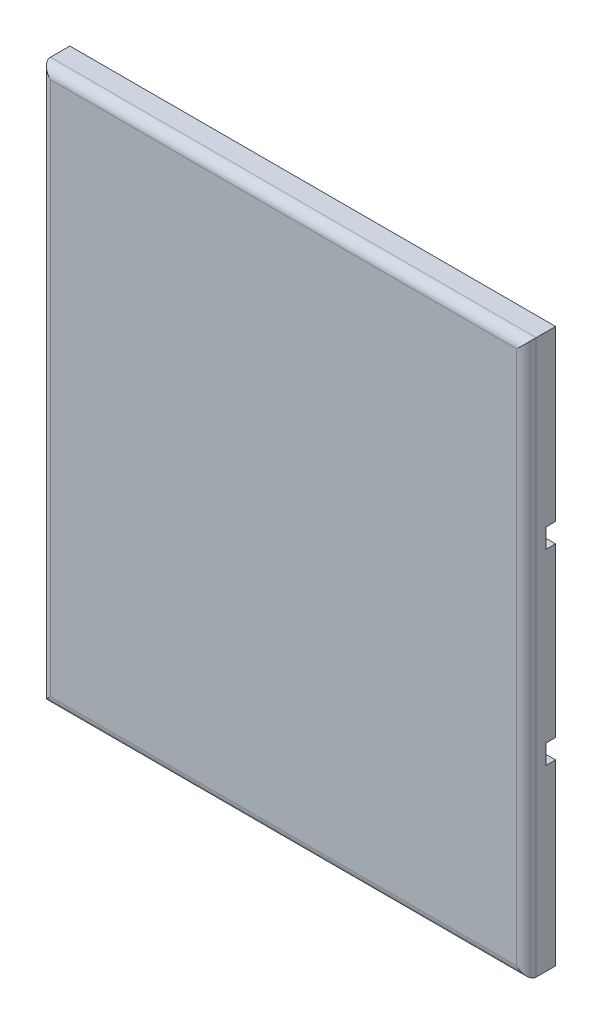
ISO-10303-21;
HEADER;
FILE_DESCRIPTION(('STEP AP214'),'2;1');
FILE_NAME('part.step','',(''),(''),'','','');
FILE_SCHEMA(('AUTOMOTIVE_DESIGN { 1 0 10303 214 1 1 1 1 }'));
ENDSEC;
DATA;
#1=APPLICATION_CONTEXT('core data for automotive mechanical design processes');
#2=APPLICATION_PROTOCOL_DEFINITION('international standard','automotive_design',2000,#1);
#3=PRODUCT_CONTEXT('',#1,'mechanical');
#4=PRODUCT('Part','Part','',(#3));
#5=PRODUCT_RELATED_PRODUCT_CATEGORY('part','',(#4));
#6=PRODUCT_DEFINITION_FORMATION('','',#4);
#7=PRODUCT_DEFINITION_CONTEXT('part definition',#1,'design');
#8=PRODUCT_DEFINITION('design','',#6,#7);
#9=PRODUCT_DEFINITION_SHAPE('','',#8);
#10=(LENGTH_UNIT() NAMED_UNIT(*) SI_UNIT(.MILLI.,.METRE.));
#11=(NAMED_UNIT(*) PLANE_ANGLE_UNIT() SI_UNIT($,.RADIAN.));
#12=(NAMED_UNIT(*) SI_UNIT($,.STERADIAN.) SOLID_ANGLE_UNIT());
#13=UNCERTAINTY_MEASURE_WITH_UNIT(LENGTH_MEASURE(1.E-05),#10,'distance_accuracy_value','');
#14=(GEOMETRIC_REPRESENTATION_CONTEXT(3) GLOBAL_UNCERTAINTY_ASSIGNED_CONTEXT((#13)) GLOBAL_UNIT_ASSIGNED_CONTEXT((#10,
#11,#12)) REPRESENTATION_CONTEXT('',''));
#15=CARTESIAN_POINT('',(0.,0.,0.));
#16=DIRECTION('',(0.,0.,1.));
#17=DIRECTION('',(1.,0.,0.));
#18=AXIS2_PLACEMENT_3D('',#15,#16,#17);
#19=CARTESIAN_POINT('',(0.,0.,30.));
#20=DIRECTION('',(-1.,0.,0.));
#21=DIRECTION('',(0.,0.,1.));
#22=AXIS2_PLACEMENT_3D('',#19,#20,#21);
#23=PLANE('',#22);
#24=DIRECTION('',(0.,0.,1.));
#25=VECTOR('',#24,1.);
#26=CARTESIAN_POINT('',(0.,-173.821390857293,30.));
#27=LINE('',#26,#25);
#28=CARTESIAN_POINT('',(0.,-173.821390857293,0.));
#29=VERTEX_POINT('',#28);
#30=CARTESIAN_POINT('',(0.,-173.821390857293,10.));
#31=VERTEX_POINT('',#30);
#32=EDGE_CURVE('E236',#29,#31,#27,.T.);
#33=ORIENTED_EDGE('',*,*,#32,.F.);
#34=DIRECTION('',(0.,1.,0.));
#35=VECTOR('',#34,1.);
#36=CARTESIAN_POINT('',(0.,0.,0.));
#37=LINE('',#36,#35);
#38=CARTESIAN_POINT('',(0.,0.,0.));
#39=VERTEX_POINT('',#38);
#40=EDGE_CURVE('E208',#29,#39,#37,.T.);
#41=ORIENTED_EDGE('',*,*,#40,.T.);
#42=DIRECTION('',(0.,0.,-1.));
#43=VECTOR('',#42,1.);
#44=CARTESIAN_POINT('',(0.,0.,30.));
#45=LINE('',#44,#43);
#46=CARTESIAN_POINT('',(0.,0.,20.));
#47=VERTEX_POINT('',#46);
#48=EDGE_CURVE('E175',#47,#39,#45,.T.);
#49=ORIENTED_EDGE('',*,*,#48,.F.);
#50=DIRECTION('',(0.,1.,0.));
#51=VECTOR('',#50,1.);
#52=CARTESIAN_POINT('',(0.,0.,20.));
#53=LINE('',#52,#51);
#54=CARTESIAN_POINT('',(0.,-570.,20.));
#55=VERTEX_POINT('',#54);
#56=EDGE_CURVE('E192',#47,#55,#53,.F.);
#57=ORIENTED_EDGE('',*,*,#56,.T.);
#58=DIRECTION('',(0.,0.,-1.));
#59=VECTOR('',#58,1.);
#60=CARTESIAN_POINT('',(0.,-570.,30.));
#61=LINE('',#60,#59);
#62=CARTESIAN_POINT('',(0.,-570.,0.));
#63=VERTEX_POINT('',#62);
#64=EDGE_CURVE('E168',#55,#63,#61,.T.);
#65=ORIENTED_EDGE('',*,*,#64,.T.);
#66=CARTESIAN_POINT('',(0.,-386.410467709479,0.));
#67=VERTEX_POINT('',#66);
#68=EDGE_CURVE('E228',#63,#67,#37,.T.);
#69=ORIENTED_EDGE('',*,*,#68,.T.);
#70=DIRECTION('',(0.,0.,-1.));
#71=VECTOR('',#70,1.);
#72=CARTESIAN_POINT('',(0.,-386.410467709479,30.));
#73=LINE('',#72,#71);
#74=CARTESIAN_POINT('',(0.,-386.410467709479,10.));
#75=VERTEX_POINT('',#74);
#76=EDGE_CURVE('E58',#75,#67,#73,.T.);
#77=ORIENTED_EDGE('',*,*,#76,.F.);
#78=DIRECTION('',(0.,1.,0.));
#79=VECTOR('',#78,1.);
#80=CARTESIAN_POINT('',(0.,0.,10.));
#81=LINE('',#80,#79);
#82=CARTESIAN_POINT('',(0.,-366.410467709479,10.));
#83=VERTEX_POINT('',#82);
#84=EDGE_CURVE('E200',#75,#83,#81,.T.);
#85=ORIENTED_EDGE('',*,*,#84,.T.);
#86=DIRECTION('',(0.,0.,-1.));
#87=VECTOR('',#86,1.);
#88=CARTESIAN_POINT('',(0.,-366.410467709479,30.));
#89=LINE('',#88,#87);
#90=CARTESIAN_POINT('',(0.,-366.410467709479,0.));
#91=VERTEX_POINT('',#90);
#92=EDGE_CURVE('E255',#83,#91,#89,.T.);
#93=ORIENTED_EDGE('',*,*,#92,.T.);
#94=CARTESIAN_POINT('',(0.,-193.821390857293,0.));
#95=VERTEX_POINT('',#94);
#96=EDGE_CURVE('E230',#91,#95,#37,.T.);
#97=ORIENTED_EDGE('',*,*,#96,.T.);
#98=DIRECTION('',(0.,0.,1.));
#99=VECTOR('',#98,1.);
#100=CARTESIAN_POINT('',(0.,-193.821390857293,30.));
#101=LINE('',#100,#99);
#102=CARTESIAN_POINT('',(0.,-193.821390857293,10.));
#103=VERTEX_POINT('',#102);
#104=EDGE_CURVE('E50',#95,#103,#101,.T.);
#105=ORIENTED_EDGE('',*,*,#104,.T.);
#106=DIRECTION('',(0.,1.,0.));
#107=VECTOR('',#106,1.);
#108=CARTESIAN_POINT('',(0.,0.,10.));
#109=LINE('',#108,#107);
#110=EDGE_CURVE('E237',#103,#31,#109,.T.);
#111=ORIENTED_EDGE('',*,*,#110,.T.);
#112=EDGE_LOOP('',(#33,#41,#49,#57,#65,#69,#77,#85,#93,#97,#105,#111));
#113=FACE_BOUND('',#112,.T.);
#114=ADVANCED_FACE('F35',(#113),#23,.F.);
#115=CARTESIAN_POINT('',(-500.,0.,30.));
#116=DIRECTION('',(1.,0.,0.));
#117=DIRECTION('',(0.,0.,-1.));
#118=AXIS2_PLACEMENT_3D('',#115,#116,#117);
#119=PLANE('',#118);
#120=DIRECTION('',(0.,0.,-1.));
#121=VECTOR('',#120,1.);
#122=CARTESIAN_POINT('',(-500.,-173.821390857293,30.));
#123=LINE('',#122,#121);
#124=CARTESIAN_POINT('',(-500.,-173.821390857293,10.));
#125=VERTEX_POINT('',#124);
#126=CARTESIAN_POINT('',(-500.,-173.821390857293,0.));
#127=VERTEX_POINT('',#126);
#128=EDGE_CURVE('E220',#125,#127,#123,.T.);
#129=ORIENTED_EDGE('',*,*,#128,.F.);
#130=DIRECTION('',(0.,-1.,0.));
#131=VECTOR('',#130,1.);
#132=CARTESIAN_POINT('',(-500.,0.,10.));
#133=LINE('',#132,#131);
#134=CARTESIAN_POINT('',(-500.,-193.821390857293,10.));
#135=VERTEX_POINT('',#134);
#136=EDGE_CURVE('E11',#125,#135,#133,.T.);
#137=ORIENTED_EDGE('',*,*,#136,.T.);
#138=DIRECTION('',(0.,0.,-1.));
#139=VECTOR('',#138,1.);
#140=CARTESIAN_POINT('',(-500.,-193.821390857293,30.));
#141=LINE('',#140,#139);
#142=CARTESIAN_POINT('',(-500.,-193.821390857293,0.));
#143=VERTEX_POINT('',#142);
#144=EDGE_CURVE('E138',#135,#143,#141,.T.);
#145=ORIENTED_EDGE('',*,*,#144,.T.);
#146=DIRECTION('',(0.,-1.,0.));
#147=VECTOR('',#146,1.);
#148=CARTESIAN_POINT('',(-500.,0.,0.));
#149=LINE('',#148,#147);
#150=CARTESIAN_POINT('',(-500.,-366.410467709479,0.));
#151=VERTEX_POINT('',#150);
#152=EDGE_CURVE('E150',#143,#151,#149,.T.);
#153=ORIENTED_EDGE('',*,*,#152,.T.);
#154=DIRECTION('',(0.,0.,1.));
#155=VECTOR('',#154,1.);
#156=CARTESIAN_POINT('',(-500.,-366.410467709479,30.));
#157=LINE('',#156,#155);
#158=CARTESIAN_POINT('',(-500.,-366.410467709479,10.));
#159=VERTEX_POINT('',#158);
#160=EDGE_CURVE('E253',#151,#159,#157,.T.);
#161=ORIENTED_EDGE('',*,*,#160,.T.);
#162=DIRECTION('',(0.,-1.,0.));
#163=VECTOR('',#162,1.);
#164=CARTESIAN_POINT('',(-500.,0.,10.));
#165=LINE('',#164,#163);
#166=CARTESIAN_POINT('',(-500.,-386.410467709479,10.));
#167=VERTEX_POINT('',#166);
#168=EDGE_CURVE('E144',#159,#167,#165,.T.);
#169=ORIENTED_EDGE('',*,*,#168,.T.);
#170=DIRECTION('',(0.,0.,1.));
#171=VECTOR('',#170,1.);
#172=CARTESIAN_POINT('',(-500.,-386.410467709479,30.));
#173=LINE('',#172,#171);
#174=CARTESIAN_POINT('',(-500.,-386.410467709479,0.));
#175=VERTEX_POINT('',#174);
#176=EDGE_CURVE('E250',#175,#167,#173,.T.);
#177=ORIENTED_EDGE('',*,*,#176,.F.);
#178=CARTESIAN_POINT('',(-500.,-570.,0.));
#179=VERTEX_POINT('',#178);
#180=EDGE_CURVE('E158',#175,#179,#149,.T.);
#181=ORIENTED_EDGE('',*,*,#180,.T.);
#182=DIRECTION('',(0.,0.,-1.));
#183=VECTOR('',#182,1.);
#184=CARTESIAN_POINT('',(-500.,-570.,30.));
#185=LINE('',#184,#183);
#186=CARTESIAN_POINT('',(-500.,-570.,20.));
#187=VERTEX_POINT('',#186);
#188=EDGE_CURVE('E170',#187,#179,#185,.T.);
#189=ORIENTED_EDGE('',*,*,#188,.F.);
#190=DIRECTION('',(0.,-1.,0.));
#191=VECTOR('',#190,1.);
#192=CARTESIAN_POINT('',(-500.,0.,20.));
#193=LINE('',#192,#191);
#194=CARTESIAN_POINT('',(-500.,0.,20.));
#195=VERTEX_POINT('',#194);
#196=EDGE_CURVE('E187',#187,#195,#193,.F.);
#197=ORIENTED_EDGE('',*,*,#196,.T.);
#198=DIRECTION('',(0.,0.,-1.));
#199=VECTOR('',#198,1.);
#200=CARTESIAN_POINT('',(-500.,0.,30.));
#201=LINE('',#200,#199);
#202=CARTESIAN_POINT('',(-500.,0.,0.));
#203=VERTEX_POINT('',#202);
#204=EDGE_CURVE('E173',#195,#203,#201,.T.);
#205=ORIENTED_EDGE('',*,*,#204,.T.);
#206=EDGE_CURVE('E157',#203,#127,#149,.T.);
#207=ORIENTED_EDGE('',*,*,#206,.T.);
#208=EDGE_LOOP('',(#129,#137,#145,#153,#161,#169,#177,#181,#189,#197,#205,#207));
#209=FACE_BOUND('',#208,.T.);
#210=ADVANCED_FACE('F148',(#209),#119,.F.);
#211=CARTESIAN_POINT('',(0.,0.,0.));
#212=DIRECTION('',(0.,0.,-1.));
#213=DIRECTION('',(-1.,0.,0.));
#214=AXIS2_PLACEMENT_3D('',#211,#212,#213);
#215=PLANE('',#214);
#216=ORIENTED_EDGE('',*,*,#40,.F.);
#217=DIRECTION('',(-1.,0.,0.));
#218=VECTOR('',#217,1.);
#219=CARTESIAN_POINT('',(0.,-173.821390857293,0.));
#220=LINE('',#219,#218);
#221=EDGE_CURVE('E43',#29,#127,#220,.T.);
#222=ORIENTED_EDGE('',*,*,#221,.T.);
#223=ORIENTED_EDGE('',*,*,#206,.F.);
#224=DIRECTION('',(-1.,0.,0.));
#225=VECTOR('',#224,1.);
#226=CARTESIAN_POINT('',(0.,0.,0.));
#227=LINE('',#226,#225);
#228=EDGE_CURVE('E162',#39,#203,#227,.T.);
#229=ORIENTED_EDGE('',*,*,#228,.F.);
#230=EDGE_LOOP('',(#216,#222,#223,#229));
#231=FACE_BOUND('',#230,.T.);
#232=ADVANCED_FACE('F216',(#231),#215,.T.);
#233=ORIENTED_EDGE('',*,*,#180,.F.);
#234=DIRECTION('',(1.,0.,0.));
#235=VECTOR('',#234,1.);
#236=CARTESIAN_POINT('',(0.,-386.410467709479,0.));
#237=LINE('',#236,#235);
#238=EDGE_CURVE('E196',#175,#67,#237,.T.);
#239=ORIENTED_EDGE('',*,*,#238,.T.);
#240=ORIENTED_EDGE('',*,*,#68,.F.);
#241=DIRECTION('',(1.,0.,0.));
#242=VECTOR('',#241,1.);
#243=CARTESIAN_POINT('',(0.,-570.,0.));
#244=LINE('',#243,#242);
#245=EDGE_CURVE('E161',#179,#63,#244,.T.);
#246=ORIENTED_EDGE('',*,*,#245,.F.);
#247=EDGE_LOOP('',(#233,#239,#240,#246));
#248=FACE_BOUND('',#247,.T.);
#249=ADVANCED_FACE('F267',(#248),#215,.T.);
#250=CARTESIAN_POINT('',(0.,0.,30.));
#251=DIRECTION('',(0.,-1.,0.));
#252=DIRECTION('',(1.,0.,0.));
#253=AXIS2_PLACEMENT_3D('',#250,#251,#252);
#254=PLANE('',#253);
#255=ORIENTED_EDGE('',*,*,#204,.F.);
#256=DIRECTION('',(-1.,0.,0.));
#257=VECTOR('',#256,1.);
#258=CARTESIAN_POINT('',(0.,0.,20.));
#259=LINE('',#258,#257);
#260=EDGE_CURVE('E194',#195,#47,#259,.F.);
#261=ORIENTED_EDGE('',*,*,#260,.T.);
#262=ORIENTED_EDGE('',*,*,#48,.T.);
#263=ORIENTED_EDGE('',*,*,#228,.T.);
#264=EDGE_LOOP('',(#255,#261,#262,#263));
#265=FACE_BOUND('',#264,.T.);
#266=ADVANCED_FACE('F226',(#265),#254,.F.);
#267=CARTESIAN_POINT('',(0.,-570.,30.));
#268=DIRECTION('',(0.,1.,0.));
#269=DIRECTION('',(-1.,0.,0.));
#270=AXIS2_PLACEMENT_3D('',#267,#268,#269);
#271=PLANE('',#270);
#272=ORIENTED_EDGE('',*,*,#64,.F.);
#273=DIRECTION('',(1.,0.,0.));
#274=VECTOR('',#273,1.);
#275=CARTESIAN_POINT('',(0.,-570.,20.));
#276=LINE('',#275,#274);
#277=EDGE_CURVE('E190',#55,#187,#276,.F.);
#278=ORIENTED_EDGE('',*,*,#277,.T.);
#279=ORIENTED_EDGE('',*,*,#188,.T.);
#280=ORIENTED_EDGE('',*,*,#245,.T.);
#281=EDGE_LOOP('',(#272,#278,#279,#280));
#282=FACE_BOUND('',#281,.T.);
#283=ADVANCED_FACE('F270',(#282),#271,.F.);
#284=CARTESIAN_POINT('',(0.,0.,30.));
#285=DIRECTION('',(0.,0.,-1.));
#286=DIRECTION('',(-1.,0.,0.));
#287=AXIS2_PLACEMENT_3D('',#284,#285,#286);
#288=PLANE('',#287);
#289=DIRECTION('',(-1.,0.,0.));
#290=VECTOR('',#289,1.);
#291=CARTESIAN_POINT('',(0.,-10.,30.));
#292=LINE('',#291,#290);
#293=CARTESIAN_POINT('',(-10.,-10.,30.));
#294=VERTEX_POINT('',#293);
#295=CARTESIAN_POINT('',(-490.,-10.0000000000001,30.));
#296=VERTEX_POINT('',#295);
#297=EDGE_CURVE('E178',#294,#296,#292,.T.);
#298=ORIENTED_EDGE('',*,*,#297,.T.);
#299=DIRECTION('',(0.,-1.,0.));
#300=VECTOR('',#299,1.);
#301=CARTESIAN_POINT('',(-490.,0.,30.));
#302=LINE('',#301,#300);
#303=CARTESIAN_POINT('',(-490.,-560.,30.));
#304=VERTEX_POINT('',#303);
#305=EDGE_CURVE('E184',#296,#304,#302,.T.);
#306=ORIENTED_EDGE('',*,*,#305,.T.);
#307=DIRECTION('',(1.,0.,0.));
#308=VECTOR('',#307,1.);
#309=CARTESIAN_POINT('',(1.24344978758018E-13,-560.,30.));
#310=LINE('',#309,#308);
#311=CARTESIAN_POINT('',(-10.,-560.,30.));
#312=VERTEX_POINT('',#311);
#313=EDGE_CURVE('E182',#304,#312,#310,.T.);
#314=ORIENTED_EDGE('',*,*,#313,.T.);
#315=DIRECTION('',(0.,1.,0.));
#316=VECTOR('',#315,1.);
#317=CARTESIAN_POINT('',(-10.,0.,30.));
#318=LINE('',#317,#316);
#319=EDGE_CURVE('E180',#312,#294,#318,.T.);
#320=ORIENTED_EDGE('',*,*,#319,.T.);
#321=EDGE_LOOP('',(#298,#306,#314,#320));
#322=FACE_BOUND('',#321,.T.);
#323=ADVANCED_FACE('F284',(#322),#288,.F.);
#324=DIRECTION('',(-1.,0.,0.));
#325=VECTOR('',#324,1.);
#326=CARTESIAN_POINT('',(0.,-193.821390857293,0.));
#327=LINE('',#326,#325);
#328=EDGE_CURVE('E135',#95,#143,#327,.T.);
#329=ORIENTED_EDGE('',*,*,#328,.F.);
#330=ORIENTED_EDGE('',*,*,#96,.F.);
#331=DIRECTION('',(1.,0.,0.));
#332=VECTOR('',#331,1.);
#333=CARTESIAN_POINT('',(0.,-366.410467709479,0.));
#334=LINE('',#333,#332);
#335=EDGE_CURVE('E156',#151,#91,#334,.T.);
#336=ORIENTED_EDGE('',*,*,#335,.F.);
#337=ORIENTED_EDGE('',*,*,#152,.F.);
#338=EDGE_LOOP('',(#329,#330,#336,#337));
#339=FACE_BOUND('',#338,.T.);
#340=ADVANCED_FACE('F155',(#339),#215,.T.);
#341=CARTESIAN_POINT('',(-10.,0.,20.));
#342=DIRECTION('',(0.,1.,0.));
#343=DIRECTION('',(0.,0.,1.));
#344=AXIS2_PLACEMENT_3D('',#341,#342,#343);
#345=CYLINDRICAL_SURFACE('',#344,10.);
#346=CARTESIAN_POINT('',(-10.,-560.,20.));
#347=DIRECTION('',(0.707106781186547,0.707106781186548,0.));
#348=DIRECTION('',(-0.707106781186548,0.707106781186547,0.));
#349=AXIS2_PLACEMENT_3D('',#346,#347,#348);
#350=ELLIPSE('',#349,14.1421356237309,10.);
#351=EDGE_CURVE('E202',#55,#312,#350,.F.);
#352=ORIENTED_EDGE('',*,*,#351,.F.);
#353=ORIENTED_EDGE('',*,*,#56,.F.);
#354=CARTESIAN_POINT('',(-10.,-10.,20.));
#355=DIRECTION('',(-0.707106781186548,0.707106781186547,0.));
#356=DIRECTION('',(-0.707106781186547,-0.707106781186548,0.));
#357=AXIS2_PLACEMENT_3D('',#354,#355,#356);
#358=ELLIPSE('',#357,14.142135623731,10.);
#359=EDGE_CURVE('E205',#294,#47,#358,.T.);
#360=ORIENTED_EDGE('',*,*,#359,.F.);
#361=ORIENTED_EDGE('',*,*,#319,.F.);
#362=EDGE_LOOP('',(#352,#353,#360,#361));
#363=FACE_BOUND('',#362,.T.);
#364=ADVANCED_FACE('F37',(#363),#345,.T.);
#365=CARTESIAN_POINT('',(0.,-10.,20.));
#366=DIRECTION('',(-1.,0.,0.));
#367=DIRECTION('',(0.,-1.,0.));
#368=AXIS2_PLACEMENT_3D('',#365,#366,#367);
#369=CYLINDRICAL_SURFACE('',#368,10.);
#370=ORIENTED_EDGE('',*,*,#359,.T.);
#371=ORIENTED_EDGE('',*,*,#260,.F.);
#372=CARTESIAN_POINT('',(-490.,-10.0000000000001,20.));
#373=DIRECTION('',(-0.707106781186547,-0.707106781186548,0.));
#374=DIRECTION('',(-0.707106781186548,0.707106781186547,0.));
#375=AXIS2_PLACEMENT_3D('',#372,#373,#374);
#376=ELLIPSE('',#375,14.1421356237309,10.);
#377=EDGE_CURVE('E199',#296,#195,#376,.T.);
#378=ORIENTED_EDGE('',*,*,#377,.F.);
#379=ORIENTED_EDGE('',*,*,#297,.F.);
#380=EDGE_LOOP('',(#370,#371,#378,#379));
#381=FACE_BOUND('',#380,.T.);
#382=ADVANCED_FACE('F288',(#381),#369,.T.);
#383=CARTESIAN_POINT('',(1.24344978758018E-13,-560.,20.));
#384=DIRECTION('',(1.,0.,0.));
#385=DIRECTION('',(0.,1.,0.));
#386=AXIS2_PLACEMENT_3D('',#383,#384,#385);
#387=CYLINDRICAL_SURFACE('',#386,10.);
#388=ORIENTED_EDGE('',*,*,#351,.T.);
#389=ORIENTED_EDGE('',*,*,#313,.F.);
#390=CARTESIAN_POINT('',(-490.,-560.,20.));
#391=DIRECTION('',(0.707106781186548,-0.707106781186547,0.));
#392=DIRECTION('',(0.707106781186547,0.707106781186548,0.));
#393=AXIS2_PLACEMENT_3D('',#390,#391,#392);
#394=ELLIPSE('',#393,14.142135623731,10.);
#395=EDGE_CURVE('E197',#187,#304,#394,.F.);
#396=ORIENTED_EDGE('',*,*,#395,.F.);
#397=ORIENTED_EDGE('',*,*,#277,.F.);
#398=EDGE_LOOP('',(#388,#389,#396,#397));
#399=FACE_BOUND('',#398,.T.);
#400=ADVANCED_FACE('F281',(#399),#387,.T.);
#401=CARTESIAN_POINT('',(-490.,0.,20.));
#402=DIRECTION('',(0.,-1.,0.));
#403=DIRECTION('',(0.,0.,-1.));
#404=AXIS2_PLACEMENT_3D('',#401,#402,#403);
#405=CYLINDRICAL_SURFACE('',#404,10.);
#406=ORIENTED_EDGE('',*,*,#377,.T.);
#407=ORIENTED_EDGE('',*,*,#196,.F.);
#408=ORIENTED_EDGE('',*,*,#395,.T.);
#409=ORIENTED_EDGE('',*,*,#305,.F.);
#410=EDGE_LOOP('',(#406,#407,#408,#409));
#411=FACE_BOUND('',#410,.T.);
#412=ADVANCED_FACE('F275',(#411),#405,.T.);
#413=CARTESIAN_POINT('',(0.,0.,10.));
#414=DIRECTION('',(0.,0.,1.));
#415=DIRECTION('',(1.,0.,0.));
#416=AXIS2_PLACEMENT_3D('',#413,#414,#415);
#417=PLANE('',#416);
#418=DIRECTION('',(1.,0.,0.));
#419=VECTOR('',#418,1.);
#420=CARTESIAN_POINT('',(0.,-386.410467709479,10.));
#421=LINE('',#420,#419);
#422=EDGE_CURVE('E248',#167,#75,#421,.T.);
#423=ORIENTED_EDGE('',*,*,#422,.F.);
#424=ORIENTED_EDGE('',*,*,#168,.F.);
#425=DIRECTION('',(1.,0.,0.));
#426=VECTOR('',#425,1.);
#427=CARTESIAN_POINT('',(0.,-366.410467709479,10.));
#428=LINE('',#427,#426);
#429=EDGE_CURVE('E241',#159,#83,#428,.T.);
#430=ORIENTED_EDGE('',*,*,#429,.T.);
#431=ORIENTED_EDGE('',*,*,#84,.F.);
#432=EDGE_LOOP('',(#423,#424,#430,#431));
#433=FACE_BOUND('',#432,.T.);
#434=ADVANCED_FACE('F260',(#433),#417,.F.);
#435=CARTESIAN_POINT('',(0.,-366.410467709479,10.));
#436=DIRECTION('',(0.,1.,0.));
#437=DIRECTION('',(0.,0.,1.));
#438=AXIS2_PLACEMENT_3D('',#435,#436,#437);
#439=PLANE('',#438);
#440=ORIENTED_EDGE('',*,*,#429,.F.);
#441=ORIENTED_EDGE('',*,*,#160,.F.);
#442=ORIENTED_EDGE('',*,*,#335,.T.);
#443=ORIENTED_EDGE('',*,*,#92,.F.);
#444=EDGE_LOOP('',(#440,#441,#442,#443));
#445=FACE_BOUND('',#444,.T.);
#446=ADVANCED_FACE('F322',(#445),#439,.F.);
#447=CARTESIAN_POINT('',(0.,-386.410467709479,10.));
#448=DIRECTION('',(0.,1.,0.));
#449=DIRECTION('',(0.,0.,1.));
#450=AXIS2_PLACEMENT_3D('',#447,#448,#449);
#451=PLANE('',#450);
#452=ORIENTED_EDGE('',*,*,#76,.T.);
#453=ORIENTED_EDGE('',*,*,#238,.F.);
#454=ORIENTED_EDGE('',*,*,#176,.T.);
#455=ORIENTED_EDGE('',*,*,#422,.T.);
#456=EDGE_LOOP('',(#452,#453,#454,#455));
#457=FACE_BOUND('',#456,.T.);
#458=ADVANCED_FACE('F262',(#457),#451,.T.);
#459=CARTESIAN_POINT('',(0.,0.,10.));
#460=DIRECTION('',(0.,0.,1.));
#461=DIRECTION('',(1.,0.,0.));
#462=AXIS2_PLACEMENT_3D('',#459,#460,#461);
#463=PLANE('',#462);
#464=DIRECTION('',(-1.,0.,0.));
#465=VECTOR('',#464,1.);
#466=CARTESIAN_POINT('',(0.,-193.821390857293,10.));
#467=LINE('',#466,#465);
#468=EDGE_CURVE('E152',#103,#135,#467,.T.);
#469=ORIENTED_EDGE('',*,*,#468,.T.);
#470=ORIENTED_EDGE('',*,*,#136,.F.);
#471=DIRECTION('',(-1.,0.,0.));
#472=VECTOR('',#471,1.);
#473=CARTESIAN_POINT('',(0.,-173.821390857293,10.));
#474=LINE('',#473,#472);
#475=EDGE_CURVE('E467',#31,#125,#474,.T.);
#476=ORIENTED_EDGE('',*,*,#475,.F.);
#477=ORIENTED_EDGE('',*,*,#110,.F.);
#478=EDGE_LOOP('',(#469,#470,#476,#477));
#479=FACE_BOUND('',#478,.T.);
#480=ADVANCED_FACE('F338',(#479),#463,.F.);
#481=CARTESIAN_POINT('',(0.,-173.821390857293,10.));
#482=DIRECTION('',(0.,-1.,0.));
#483=DIRECTION('',(1.,0.,0.));
#484=AXIS2_PLACEMENT_3D('',#481,#482,#483);
#485=PLANE('',#484);
#486=ORIENTED_EDGE('',*,*,#32,.T.);
#487=ORIENTED_EDGE('',*,*,#475,.T.);
#488=ORIENTED_EDGE('',*,*,#128,.T.);
#489=ORIENTED_EDGE('',*,*,#221,.F.);
#490=EDGE_LOOP('',(#486,#487,#488,#489));
#491=FACE_BOUND('',#490,.T.);
#492=ADVANCED_FACE('F345',(#491),#485,.T.);
#493=CARTESIAN_POINT('',(0.,-193.821390857293,10.));
#494=DIRECTION('',(0.,-1.,0.));
#495=DIRECTION('',(1.,0.,0.));
#496=AXIS2_PLACEMENT_3D('',#493,#494,#495);
#497=PLANE('',#496);
#498=ORIENTED_EDGE('',*,*,#328,.T.);
#499=ORIENTED_EDGE('',*,*,#144,.F.);
#500=ORIENTED_EDGE('',*,*,#468,.F.);
#501=ORIENTED_EDGE('',*,*,#104,.F.);
#502=EDGE_LOOP('',(#498,#499,#500,#501));
#503=FACE_BOUND('',#502,.T.);
#504=ADVANCED_FACE('F137',(#503),#497,.F.);
#505=CLOSED_SHELL('',(#114,#210,#232,#249,#266,#283,#323,#340,#364,#382,#400,#412,#434,#446,
#458,#480,#492,#504));
#506=MANIFOLD_SOLID_BREP('B2',#505);
#507=ADVANCED_BREP_SHAPE_REPRESENTATION('',(#18,#506),#14);
#508=SHAPE_DEFINITION_REPRESENTATION(#9,#507);
ENDSEC;
END-ISO-10303-21;
